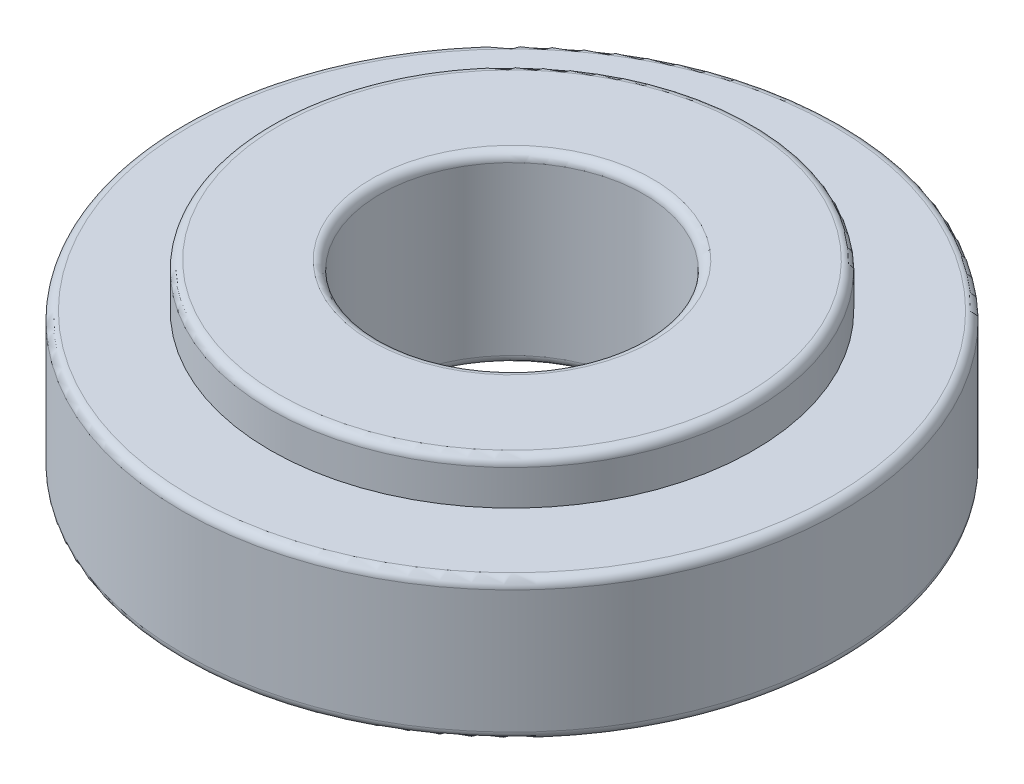
ISO-10303-21;
HEADER;
FILE_DESCRIPTION(('STEP AP214'),'2;1');
FILE_NAME('part.step','',(''),(''),'','','');
FILE_SCHEMA(('AUTOMOTIVE_DESIGN { 1 0 10303 214 1 1 1 1 }'));
ENDSEC;
DATA;
#1=APPLICATION_CONTEXT('core data for automotive mechanical design processes');
#2=APPLICATION_PROTOCOL_DEFINITION('international standard','automotive_design',2000,#1);
#3=PRODUCT_CONTEXT('',#1,'mechanical');
#4=PRODUCT('Part','Part','',(#3));
#5=PRODUCT_RELATED_PRODUCT_CATEGORY('part','',(#4));
#6=PRODUCT_DEFINITION_FORMATION('','',#4);
#7=PRODUCT_DEFINITION_CONTEXT('part definition',#1,'design');
#8=PRODUCT_DEFINITION('design','',#6,#7);
#9=PRODUCT_DEFINITION_SHAPE('','',#8);
#10=(LENGTH_UNIT() NAMED_UNIT(*) SI_UNIT(.MILLI.,.METRE.));
#11=(NAMED_UNIT(*) PLANE_ANGLE_UNIT() SI_UNIT($,.RADIAN.));
#12=(NAMED_UNIT(*) SI_UNIT($,.STERADIAN.) SOLID_ANGLE_UNIT());
#13=UNCERTAINTY_MEASURE_WITH_UNIT(LENGTH_MEASURE(1.E-05),#10,'distance_accuracy_value','');
#14=(GEOMETRIC_REPRESENTATION_CONTEXT(3) GLOBAL_UNCERTAINTY_ASSIGNED_CONTEXT((#13)) GLOBAL_UNIT_ASSIGNED_CONTEXT((#10,
#11,#12)) REPRESENTATION_CONTEXT('',''));
#15=CARTESIAN_POINT('',(0.,0.,0.));
#16=DIRECTION('',(0.,0.,1.));
#17=DIRECTION('',(1.,0.,0.));
#18=AXIS2_PLACEMENT_3D('',#15,#16,#17);
#19=CARTESIAN_POINT('',(0.,1.6,0.));
#20=DIRECTION('',(0.,-1.,0.));
#21=DIRECTION('',(0.,0.,-1.));
#22=AXIS2_PLACEMENT_3D('',#19,#20,#21);
#23=CYLINDRICAL_SURFACE('',#22,3.75);
#24=CARTESIAN_POINT('',(0.,0.1,0.));
#25=DIRECTION('',(0.,1.,0.));
#26=DIRECTION('',(0.,0.,1.));
#27=AXIS2_PLACEMENT_3D('',#24,#25,#26);
#28=CIRCLE('',#27,3.75);
#29=CARTESIAN_POINT('',(0.,0.1,3.75));
#30=VERTEX_POINT('',#29);
#31=EDGE_CURVE('E65',#30,#30,#28,.T.);
#32=ORIENTED_EDGE('',*,*,#31,.T.);
#33=EDGE_LOOP('',(#32));
#34=FACE_BOUND('',#33,.T.);
#35=CARTESIAN_POINT('',(0.,1.5,0.));
#36=DIRECTION('',(0.,1.,0.));
#37=DIRECTION('',(0.,0.,1.));
#38=AXIS2_PLACEMENT_3D('',#35,#36,#37);
#39=CIRCLE('',#38,3.75);
#40=CARTESIAN_POINT('',(0.,1.5,3.75));
#41=VERTEX_POINT('',#40);
#42=EDGE_CURVE('E68',#41,#41,#39,.F.);
#43=ORIENTED_EDGE('',*,*,#42,.T.);
#44=EDGE_LOOP('',(#43));
#45=FACE_BOUND('',#44,.T.);
#46=ADVANCED_FACE('F33',(#34,#45),#23,.T.);
#47=CARTESIAN_POINT('',(0.,1.6,0.));
#48=DIRECTION('',(0.,1.,0.));
#49=DIRECTION('',(0.,0.,1.));
#50=AXIS2_PLACEMENT_3D('',#47,#48,#49);
#51=PLANE('',#50);
#52=CARTESIAN_POINT('',(0.,1.6,0.));
#53=DIRECTION('',(0.,1.,0.));
#54=DIRECTION('',(0.,0.,1.));
#55=AXIS2_PLACEMENT_3D('',#52,#53,#54);
#56=CIRCLE('',#55,3.65);
#57=CARTESIAN_POINT('',(0.,1.6,3.65));
#58=VERTEX_POINT('',#57);
#59=EDGE_CURVE('E56',#58,#58,#56,.T.);
#60=ORIENTED_EDGE('',*,*,#59,.T.);
#61=EDGE_LOOP('',(#60));
#62=FACE_BOUND('',#61,.T.);
#63=CARTESIAN_POINT('',(0.,1.6,0.));
#64=DIRECTION('',(0.,1.,0.));
#65=DIRECTION('',(0.,0.,1.));
#66=AXIS2_PLACEMENT_3D('',#63,#64,#65);
#67=CIRCLE('',#66,2.75);
#68=CARTESIAN_POINT('',(0.,1.6,2.75));
#69=VERTEX_POINT('',#68);
#70=EDGE_CURVE('E71',#69,#69,#67,.T.);
#71=ORIENTED_EDGE('',*,*,#70,.F.);
#72=EDGE_LOOP('',(#71));
#73=FACE_BOUND('',#72,.T.);
#74=ADVANCED_FACE('F77',(#62,#73),#51,.T.);
#75=CARTESIAN_POINT('',(0.,0.,0.));
#76=DIRECTION('',(0.,1.,0.));
#77=DIRECTION('',(0.,0.,1.));
#78=AXIS2_PLACEMENT_3D('',#75,#76,#77);
#79=PLANE('',#78);
#80=CARTESIAN_POINT('',(0.,0.,0.));
#81=DIRECTION('',(0.,1.,0.));
#82=DIRECTION('',(0.,0.,1.));
#83=AXIS2_PLACEMENT_3D('',#80,#81,#82);
#84=CIRCLE('',#83,3.65);
#85=CARTESIAN_POINT('',(0.,0.,3.65));
#86=VERTEX_POINT('',#85);
#87=EDGE_CURVE('E59',#86,#86,#84,.F.);
#88=ORIENTED_EDGE('',*,*,#87,.T.);
#89=EDGE_LOOP('',(#88));
#90=FACE_BOUND('',#89,.T.);
#91=CARTESIAN_POINT('',(0.,0.,0.));
#92=DIRECTION('',(0.,1.,0.));
#93=DIRECTION('',(0.,0.,1.));
#94=AXIS2_PLACEMENT_3D('',#91,#92,#93);
#95=CIRCLE('',#94,1.6);
#96=CARTESIAN_POINT('',(0.,0.,1.6));
#97=VERTEX_POINT('',#96);
#98=EDGE_CURVE('E62',#97,#97,#95,.T.);
#99=ORIENTED_EDGE('',*,*,#98,.T.);
#100=EDGE_LOOP('',(#99));
#101=FACE_BOUND('',#100,.T.);
#102=ADVANCED_FACE('F79',(#90,#101),#79,.F.);
#103=CARTESIAN_POINT('',(0.,-0.4,0.));
#104=DIRECTION('',(0.,1.,0.));
#105=DIRECTION('',(0.,0.,1.));
#106=AXIS2_PLACEMENT_3D('',#103,#104,#105);
#107=CYLINDRICAL_SURFACE('',#106,1.5);
#108=CARTESIAN_POINT('',(0.,2.,0.));
#109=DIRECTION('',(0.,1.,0.));
#110=DIRECTION('',(0.,0.,1.));
#111=AXIS2_PLACEMENT_3D('',#108,#109,#110);
#112=CIRCLE('',#111,1.5);
#113=CARTESIAN_POINT('',(0.,2.,1.5));
#114=VERTEX_POINT('',#113);
#115=EDGE_CURVE('E48',#114,#114,#112,.T.);
#116=ORIENTED_EDGE('',*,*,#115,.T.);
#117=EDGE_LOOP('',(#116));
#118=FACE_BOUND('',#117,.T.);
#119=CARTESIAN_POINT('',(0.,0.1,0.));
#120=DIRECTION('',(0.,1.,0.));
#121=DIRECTION('',(0.,0.,1.));
#122=AXIS2_PLACEMENT_3D('',#119,#120,#121);
#123=CIRCLE('',#122,1.5);
#124=CARTESIAN_POINT('',(0.,0.1,1.5));
#125=VERTEX_POINT('',#124);
#126=EDGE_CURVE('E53',#125,#125,#123,.F.);
#127=ORIENTED_EDGE('',*,*,#126,.T.);
#128=EDGE_LOOP('',(#127));
#129=FACE_BOUND('',#128,.T.);
#130=ADVANCED_FACE('F86',(#118,#129),#107,.F.);
#131=CARTESIAN_POINT('',(0.,2.1,0.));
#132=DIRECTION('',(0.,-1.,0.));
#133=DIRECTION('',(0.,0.,-1.));
#134=AXIS2_PLACEMENT_3D('',#131,#132,#133);
#135=CYLINDRICAL_SURFACE('',#134,2.75);
#136=CARTESIAN_POINT('',(0.,2.,0.));
#137=DIRECTION('',(0.,1.,0.));
#138=DIRECTION('',(0.,0.,1.));
#139=AXIS2_PLACEMENT_3D('',#136,#137,#138);
#140=CIRCLE('',#139,2.75);
#141=CARTESIAN_POINT('',(0.,2.,2.75));
#142=VERTEX_POINT('',#141);
#143=EDGE_CURVE('E10',#142,#142,#140,.F.);
#144=ORIENTED_EDGE('',*,*,#143,.T.);
#145=EDGE_LOOP('',(#144));
#146=FACE_BOUND('',#145,.T.);
#147=ORIENTED_EDGE('',*,*,#70,.T.);
#148=EDGE_LOOP('',(#147));
#149=FACE_BOUND('',#148,.T.);
#150=ADVANCED_FACE('F75',(#146,#149),#135,.T.);
#151=CARTESIAN_POINT('',(0.,2.1,0.));
#152=DIRECTION('',(0.,1.,0.));
#153=DIRECTION('',(0.,0.,1.));
#154=AXIS2_PLACEMENT_3D('',#151,#152,#153);
#155=PLANE('',#154);
#156=CARTESIAN_POINT('',(0.,2.1,0.));
#157=DIRECTION('',(0.,1.,0.));
#158=DIRECTION('',(0.,0.,1.));
#159=AXIS2_PLACEMENT_3D('',#156,#157,#158);
#160=CIRCLE('',#159,1.6);
#161=CARTESIAN_POINT('',(0.,2.1,1.6));
#162=VERTEX_POINT('',#161);
#163=EDGE_CURVE('E40',#162,#162,#160,.F.);
#164=ORIENTED_EDGE('',*,*,#163,.T.);
#165=EDGE_LOOP('',(#164));
#166=FACE_BOUND('',#165,.T.);
#167=CARTESIAN_POINT('',(0.,2.1,0.));
#168=DIRECTION('',(0.,1.,0.));
#169=DIRECTION('',(0.,0.,1.));
#170=AXIS2_PLACEMENT_3D('',#167,#168,#169);
#171=CIRCLE('',#170,2.65);
#172=CARTESIAN_POINT('',(0.,2.1,2.65));
#173=VERTEX_POINT('',#172);
#174=EDGE_CURVE('E44',#173,#173,#171,.T.);
#175=ORIENTED_EDGE('',*,*,#174,.T.);
#176=EDGE_LOOP('',(#175));
#177=FACE_BOUND('',#176,.T.);
#178=ADVANCED_FACE('F98',(#166,#177),#155,.T.);
#179=CARTESIAN_POINT('',(0.,0.1,0.));
#180=DIRECTION('',(0.,1.,0.));
#181=DIRECTION('',(0.,0.,1.));
#182=AXIS2_PLACEMENT_3D('',#179,#180,#181);
#183=TOROIDAL_SURFACE('',#182,3.65,0.1);
#184=ORIENTED_EDGE('',*,*,#87,.F.);
#185=EDGE_LOOP('',(#184));
#186=FACE_BOUND('',#185,.T.);
#187=ORIENTED_EDGE('',*,*,#31,.F.);
#188=EDGE_LOOP('',(#187));
#189=FACE_BOUND('',#188,.T.);
#190=ADVANCED_FACE('F94',(#186,#189),#183,.T.);
#191=CARTESIAN_POINT('',(0.,1.5,0.));
#192=DIRECTION('',(0.,1.,0.));
#193=DIRECTION('',(0.,0.,1.));
#194=AXIS2_PLACEMENT_3D('',#191,#192,#193);
#195=TOROIDAL_SURFACE('',#194,3.65,0.1);
#196=ORIENTED_EDGE('',*,*,#42,.F.);
#197=EDGE_LOOP('',(#196));
#198=FACE_BOUND('',#197,.T.);
#199=ORIENTED_EDGE('',*,*,#59,.F.);
#200=EDGE_LOOP('',(#199));
#201=FACE_BOUND('',#200,.T.);
#202=ADVANCED_FACE('F97',(#198,#201),#195,.T.);
#203=CARTESIAN_POINT('',(0.,2.,0.));
#204=DIRECTION('',(0.,1.,0.));
#205=DIRECTION('',(0.,0.,1.));
#206=AXIS2_PLACEMENT_3D('',#203,#204,#205);
#207=TOROIDAL_SURFACE('',#206,1.6,0.1);
#208=ORIENTED_EDGE('',*,*,#163,.F.);
#209=EDGE_LOOP('',(#208));
#210=FACE_BOUND('',#209,.T.);
#211=ORIENTED_EDGE('',*,*,#115,.F.);
#212=EDGE_LOOP('',(#211));
#213=FACE_BOUND('',#212,.T.);
#214=ADVANCED_FACE('F102',(#210,#213),#207,.T.);
#215=CARTESIAN_POINT('',(0.,0.1,0.));
#216=DIRECTION('',(0.,1.,0.));
#217=DIRECTION('',(0.,0.,1.));
#218=AXIS2_PLACEMENT_3D('',#215,#216,#217);
#219=TOROIDAL_SURFACE('',#218,1.6,0.1);
#220=ORIENTED_EDGE('',*,*,#126,.F.);
#221=EDGE_LOOP('',(#220));
#222=FACE_BOUND('',#221,.T.);
#223=ORIENTED_EDGE('',*,*,#98,.F.);
#224=EDGE_LOOP('',(#223));
#225=FACE_BOUND('',#224,.T.);
#226=ADVANCED_FACE('F105',(#222,#225),#219,.T.);
#227=CARTESIAN_POINT('',(0.,2.,0.));
#228=DIRECTION('',(0.,1.,0.));
#229=DIRECTION('',(0.,0.,1.));
#230=AXIS2_PLACEMENT_3D('',#227,#228,#229);
#231=TOROIDAL_SURFACE('',#230,2.65,0.1);
#232=ORIENTED_EDGE('',*,*,#143,.F.);
#233=EDGE_LOOP('',(#232));
#234=FACE_BOUND('',#233,.T.);
#235=ORIENTED_EDGE('',*,*,#174,.F.);
#236=EDGE_LOOP('',(#235));
#237=FACE_BOUND('',#236,.T.);
#238=ADVANCED_FACE('F35',(#234,#237),#231,.T.);
#239=CLOSED_SHELL('',(#46,#74,#102,#130,#150,#178,#190,#202,#214,#226,#238));
#240=MANIFOLD_SOLID_BREP('B2',#239);
#241=ADVANCED_BREP_SHAPE_REPRESENTATION('',(#18,#240),#14);
#242=SHAPE_DEFINITION_REPRESENTATION(#9,#241);
ENDSEC;
END-ISO-10303-21;
